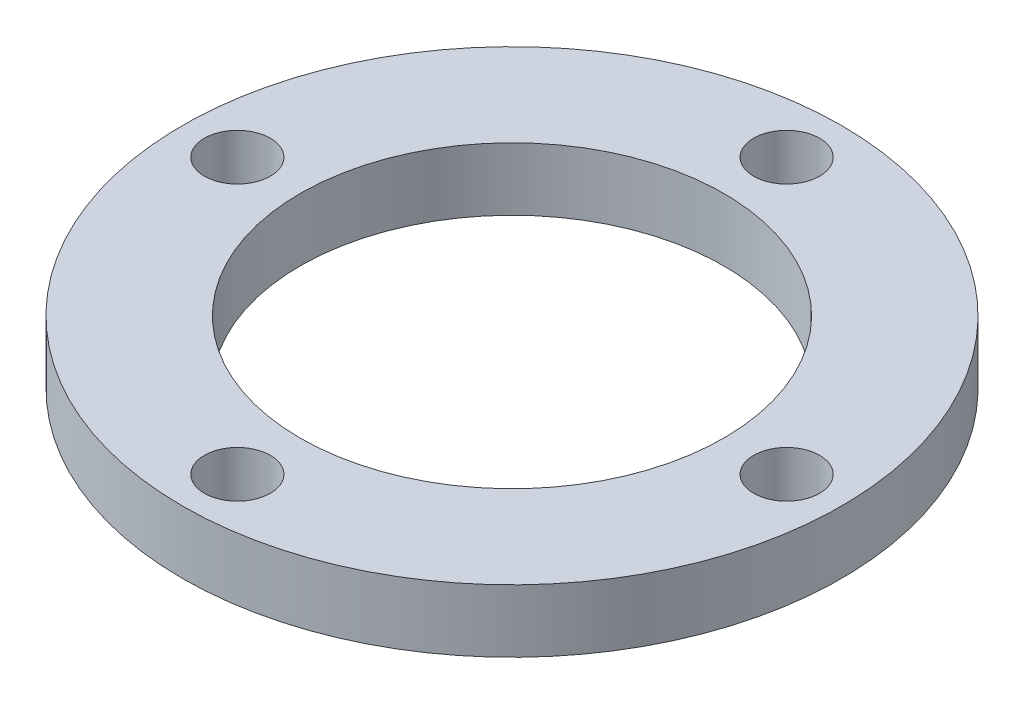
ISO-10303-21;
HEADER;
FILE_DESCRIPTION(('STEP AP214'),'2;1');
FILE_NAME('part.step','',(''),(''),'','','');
FILE_SCHEMA(('AUTOMOTIVE_DESIGN { 1 0 10303 214 1 1 1 1 }'));
ENDSEC;
DATA;
#1=APPLICATION_CONTEXT('core data for automotive mechanical design processes');
#2=APPLICATION_PROTOCOL_DEFINITION('international standard','automotive_design',2000,#1);
#3=PRODUCT_CONTEXT('',#1,'mechanical');
#4=PRODUCT('Part','Part','',(#3));
#5=PRODUCT_RELATED_PRODUCT_CATEGORY('part','',(#4));
#6=PRODUCT_DEFINITION_FORMATION('','',#4);
#7=PRODUCT_DEFINITION_CONTEXT('part definition',#1,'design');
#8=PRODUCT_DEFINITION('design','',#6,#7);
#9=PRODUCT_DEFINITION_SHAPE('','',#8);
#10=(LENGTH_UNIT() NAMED_UNIT(*) SI_UNIT(.MILLI.,.METRE.));
#11=(NAMED_UNIT(*) PLANE_ANGLE_UNIT() SI_UNIT($,.RADIAN.));
#12=(NAMED_UNIT(*) SI_UNIT($,.STERADIAN.) SOLID_ANGLE_UNIT());
#13=UNCERTAINTY_MEASURE_WITH_UNIT(LENGTH_MEASURE(1.E-05),#10,'distance_accuracy_value','');
#14=(GEOMETRIC_REPRESENTATION_CONTEXT(3) GLOBAL_UNCERTAINTY_ASSIGNED_CONTEXT((#13)) GLOBAL_UNIT_ASSIGNED_CONTEXT((#10,
#11,#12)) REPRESENTATION_CONTEXT('',''));
#15=CARTESIAN_POINT('',(0.,0.,0.));
#16=DIRECTION('',(0.,0.,1.));
#17=DIRECTION('',(1.,0.,0.));
#18=AXIS2_PLACEMENT_3D('',#15,#16,#17);
#19=CARTESIAN_POINT('',(0.,4.,0.));
#20=DIRECTION('',(0.,1.,0.));
#21=DIRECTION('',(0.,0.,1.));
#22=AXIS2_PLACEMENT_3D('',#19,#20,#21);
#23=PLANE('',#22);
#24=CARTESIAN_POINT('',(0.,4.,17.5));
#25=DIRECTION('',(0.,1.,0.));
#26=DIRECTION('',(0.,0.,1.));
#27=AXIS2_PLACEMENT_3D('',#24,#25,#26);
#28=CIRCLE('',#27,2.1);
#29=CARTESIAN_POINT('',(0.,4.,19.6));
#30=VERTEX_POINT('',#29);
#31=EDGE_CURVE('E61',#30,#30,#28,.T.);
#32=ORIENTED_EDGE('',*,*,#31,.F.);
#33=EDGE_LOOP('',(#32));
#34=FACE_BOUND('',#33,.T.);
#35=CARTESIAN_POINT('',(0.,4.,-17.5));
#36=DIRECTION('',(0.,1.,0.));
#37=DIRECTION('',(0.,0.,1.));
#38=AXIS2_PLACEMENT_3D('',#35,#36,#37);
#39=CIRCLE('',#38,2.1);
#40=CARTESIAN_POINT('',(0.,4.,-15.4));
#41=VERTEX_POINT('',#40);
#42=EDGE_CURVE('E49',#41,#41,#39,.T.);
#43=ORIENTED_EDGE('',*,*,#42,.F.);
#44=EDGE_LOOP('',(#43));
#45=FACE_BOUND('',#44,.T.);
#46=CARTESIAN_POINT('',(0.,4.,0.));
#47=DIRECTION('',(0.,1.,0.));
#48=DIRECTION('',(0.,0.,1.));
#49=AXIS2_PLACEMENT_3D('',#46,#47,#48);
#50=CIRCLE('',#49,21.);
#51=CARTESIAN_POINT('',(0.,4.,21.));
#52=VERTEX_POINT('',#51);
#53=EDGE_CURVE('E10',#52,#52,#50,.T.);
#54=ORIENTED_EDGE('',*,*,#53,.T.);
#55=EDGE_LOOP('',(#54));
#56=FACE_BOUND('',#55,.T.);
#57=CARTESIAN_POINT('',(0.,4.,0.));
#58=DIRECTION('',(0.,1.,0.));
#59=DIRECTION('',(0.,0.,1.));
#60=AXIS2_PLACEMENT_3D('',#57,#58,#59);
#61=CIRCLE('',#60,13.5);
#62=CARTESIAN_POINT('',(0.,4.,13.5));
#63=VERTEX_POINT('',#62);
#64=EDGE_CURVE('E44',#63,#63,#61,.T.);
#65=ORIENTED_EDGE('',*,*,#64,.F.);
#66=EDGE_LOOP('',(#65));
#67=FACE_BOUND('',#66,.T.);
#68=CARTESIAN_POINT('',(17.5,4.,0.));
#69=DIRECTION('',(0.,1.,0.));
#70=DIRECTION('',(0.,0.,1.));
#71=AXIS2_PLACEMENT_3D('',#68,#69,#70);
#72=CIRCLE('',#71,2.1);
#73=CARTESIAN_POINT('',(17.5,4.,2.1));
#74=VERTEX_POINT('',#73);
#75=EDGE_CURVE('E55',#74,#74,#72,.T.);
#76=ORIENTED_EDGE('',*,*,#75,.F.);
#77=EDGE_LOOP('',(#76));
#78=FACE_BOUND('',#77,.T.);
#79=CARTESIAN_POINT('',(-17.5,4.,0.));
#80=DIRECTION('',(0.,1.,0.));
#81=DIRECTION('',(0.,0.,1.));
#82=AXIS2_PLACEMENT_3D('',#79,#80,#81);
#83=CIRCLE('',#82,2.1);
#84=CARTESIAN_POINT('',(-17.5,4.,2.1));
#85=VERTEX_POINT('',#84);
#86=EDGE_CURVE('E67',#85,#85,#83,.T.);
#87=ORIENTED_EDGE('',*,*,#86,.F.);
#88=EDGE_LOOP('',(#87));
#89=FACE_BOUND('',#88,.T.);
#90=ADVANCED_FACE('F33',(#34,#45,#56,#67,#78,#89),#23,.T.);
#91=CARTESIAN_POINT('',(0.,0.,0.));
#92=DIRECTION('',(0.,1.,0.));
#93=DIRECTION('',(0.,0.,1.));
#94=AXIS2_PLACEMENT_3D('',#91,#92,#93);
#95=PLANE('',#94);
#96=CARTESIAN_POINT('',(0.,0.,0.));
#97=DIRECTION('',(0.,1.,0.));
#98=DIRECTION('',(0.,0.,1.));
#99=AXIS2_PLACEMENT_3D('',#96,#97,#98);
#100=CIRCLE('',#99,21.);
#101=CARTESIAN_POINT('',(0.,0.,21.));
#102=VERTEX_POINT('',#101);
#103=EDGE_CURVE('E37',#102,#102,#100,.T.);
#104=ORIENTED_EDGE('',*,*,#103,.F.);
#105=EDGE_LOOP('',(#104));
#106=FACE_BOUND('',#105,.T.);
#107=CARTESIAN_POINT('',(0.,0.,0.));
#108=DIRECTION('',(0.,1.,0.));
#109=DIRECTION('',(0.,0.,1.));
#110=AXIS2_PLACEMENT_3D('',#107,#108,#109);
#111=CIRCLE('',#110,13.5);
#112=CARTESIAN_POINT('',(0.,0.,13.5));
#113=VERTEX_POINT('',#112);
#114=EDGE_CURVE('E46',#113,#113,#111,.T.);
#115=ORIENTED_EDGE('',*,*,#114,.T.);
#116=EDGE_LOOP('',(#115));
#117=FACE_BOUND('',#116,.T.);
#118=CARTESIAN_POINT('',(0.,0.,-17.5));
#119=DIRECTION('',(0.,1.,0.));
#120=DIRECTION('',(0.,0.,1.));
#121=AXIS2_PLACEMENT_3D('',#118,#119,#120);
#122=CIRCLE('',#121,2.1);
#123=CARTESIAN_POINT('',(0.,0.,-15.4));
#124=VERTEX_POINT('',#123);
#125=EDGE_CURVE('E52',#124,#124,#122,.T.);
#126=ORIENTED_EDGE('',*,*,#125,.T.);
#127=EDGE_LOOP('',(#126));
#128=FACE_BOUND('',#127,.T.);
#129=CARTESIAN_POINT('',(17.5,0.,0.));
#130=DIRECTION('',(0.,1.,0.));
#131=DIRECTION('',(0.,0.,1.));
#132=AXIS2_PLACEMENT_3D('',#129,#130,#131);
#133=CIRCLE('',#132,2.1);
#134=CARTESIAN_POINT('',(17.5,0.,2.1));
#135=VERTEX_POINT('',#134);
#136=EDGE_CURVE('E58',#135,#135,#133,.T.);
#137=ORIENTED_EDGE('',*,*,#136,.T.);
#138=EDGE_LOOP('',(#137));
#139=FACE_BOUND('',#138,.T.);
#140=CARTESIAN_POINT('',(0.,0.,17.5));
#141=DIRECTION('',(0.,1.,0.));
#142=DIRECTION('',(0.,0.,1.));
#143=AXIS2_PLACEMENT_3D('',#140,#141,#142);
#144=CIRCLE('',#143,2.1);
#145=CARTESIAN_POINT('',(0.,0.,19.6));
#146=VERTEX_POINT('',#145);
#147=EDGE_CURVE('E64',#146,#146,#144,.T.);
#148=ORIENTED_EDGE('',*,*,#147,.T.);
#149=EDGE_LOOP('',(#148));
#150=FACE_BOUND('',#149,.T.);
#151=CARTESIAN_POINT('',(-17.5,0.,0.));
#152=DIRECTION('',(0.,1.,0.));
#153=DIRECTION('',(0.,0.,1.));
#154=AXIS2_PLACEMENT_3D('',#151,#152,#153);
#155=CIRCLE('',#154,2.1);
#156=CARTESIAN_POINT('',(-17.5,0.,2.1));
#157=VERTEX_POINT('',#156);
#158=EDGE_CURVE('E70',#157,#157,#155,.T.);
#159=ORIENTED_EDGE('',*,*,#158,.T.);
#160=EDGE_LOOP('',(#159));
#161=FACE_BOUND('',#160,.T.);
#162=ADVANCED_FACE('F80',(#106,#117,#128,#139,#150,#161),#95,.F.);
#163=CARTESIAN_POINT('',(0.,4.,0.));
#164=DIRECTION('',(0.,-1.,0.));
#165=DIRECTION('',(0.,0.,-1.));
#166=AXIS2_PLACEMENT_3D('',#163,#164,#165);
#167=CYLINDRICAL_SURFACE('',#166,21.);
#168=ORIENTED_EDGE('',*,*,#53,.F.);
#169=EDGE_LOOP('',(#168));
#170=FACE_BOUND('',#169,.T.);
#171=ORIENTED_EDGE('',*,*,#103,.T.);
#172=EDGE_LOOP('',(#171));
#173=FACE_BOUND('',#172,.T.);
#174=ADVANCED_FACE('F35',(#170,#173),#167,.T.);
#175=CARTESIAN_POINT('',(0.,4.,0.));
#176=DIRECTION('',(0.,-1.,0.));
#177=DIRECTION('',(0.,0.,-1.));
#178=AXIS2_PLACEMENT_3D('',#175,#176,#177);
#179=CYLINDRICAL_SURFACE('',#178,13.5);
#180=ORIENTED_EDGE('',*,*,#64,.T.);
#181=EDGE_LOOP('',(#180));
#182=FACE_BOUND('',#181,.T.);
#183=ORIENTED_EDGE('',*,*,#114,.F.);
#184=EDGE_LOOP('',(#183));
#185=FACE_BOUND('',#184,.T.);
#186=ADVANCED_FACE('F90',(#182,#185),#179,.F.);
#187=CARTESIAN_POINT('',(0.,4.,-17.5));
#188=DIRECTION('',(0.,-1.,0.));
#189=DIRECTION('',(0.,0.,-1.));
#190=AXIS2_PLACEMENT_3D('',#187,#188,#189);
#191=CYLINDRICAL_SURFACE('',#190,2.1);
#192=ORIENTED_EDGE('',*,*,#42,.T.);
#193=EDGE_LOOP('',(#192));
#194=FACE_BOUND('',#193,.T.);
#195=ORIENTED_EDGE('',*,*,#125,.F.);
#196=EDGE_LOOP('',(#195));
#197=FACE_BOUND('',#196,.T.);
#198=ADVANCED_FACE('F93',(#194,#197),#191,.F.);
#199=CARTESIAN_POINT('',(17.5,4.,0.));
#200=DIRECTION('',(0.,-1.,0.));
#201=DIRECTION('',(0.,0.,-1.));
#202=AXIS2_PLACEMENT_3D('',#199,#200,#201);
#203=CYLINDRICAL_SURFACE('',#202,2.1);
#204=ORIENTED_EDGE('',*,*,#75,.T.);
#205=EDGE_LOOP('',(#204));
#206=FACE_BOUND('',#205,.T.);
#207=ORIENTED_EDGE('',*,*,#136,.F.);
#208=EDGE_LOOP('',(#207));
#209=FACE_BOUND('',#208,.T.);
#210=ADVANCED_FACE('F97',(#206,#209),#203,.F.);
#211=CARTESIAN_POINT('',(0.,4.,17.5));
#212=DIRECTION('',(0.,-1.,0.));
#213=DIRECTION('',(0.,0.,-1.));
#214=AXIS2_PLACEMENT_3D('',#211,#212,#213);
#215=CYLINDRICAL_SURFACE('',#214,2.1);
#216=ORIENTED_EDGE('',*,*,#31,.T.);
#217=EDGE_LOOP('',(#216));
#218=FACE_BOUND('',#217,.T.);
#219=ORIENTED_EDGE('',*,*,#147,.F.);
#220=EDGE_LOOP('',(#219));
#221=FACE_BOUND('',#220,.T.);
#222=ADVANCED_FACE('F101',(#218,#221),#215,.F.);
#223=CARTESIAN_POINT('',(-17.5,4.,0.));
#224=DIRECTION('',(0.,-1.,0.));
#225=DIRECTION('',(0.,0.,-1.));
#226=AXIS2_PLACEMENT_3D('',#223,#224,#225);
#227=CYLINDRICAL_SURFACE('',#226,2.1);
#228=ORIENTED_EDGE('',*,*,#86,.T.);
#229=EDGE_LOOP('',(#228));
#230=FACE_BOUND('',#229,.T.);
#231=ORIENTED_EDGE('',*,*,#158,.F.);
#232=EDGE_LOOP('',(#231));
#233=FACE_BOUND('',#232,.T.);
#234=ADVANCED_FACE('F76',(#230,#233),#227,.F.);
#235=CLOSED_SHELL('',(#90,#162,#174,#186,#198,#210,#222,#234));
#236=MANIFOLD_SOLID_BREP('B2',#235);
#237=ADVANCED_BREP_SHAPE_REPRESENTATION('',(#18,#236),#14);
#238=SHAPE_DEFINITION_REPRESENTATION(#9,#237);
ENDSEC;
END-ISO-10303-21;
